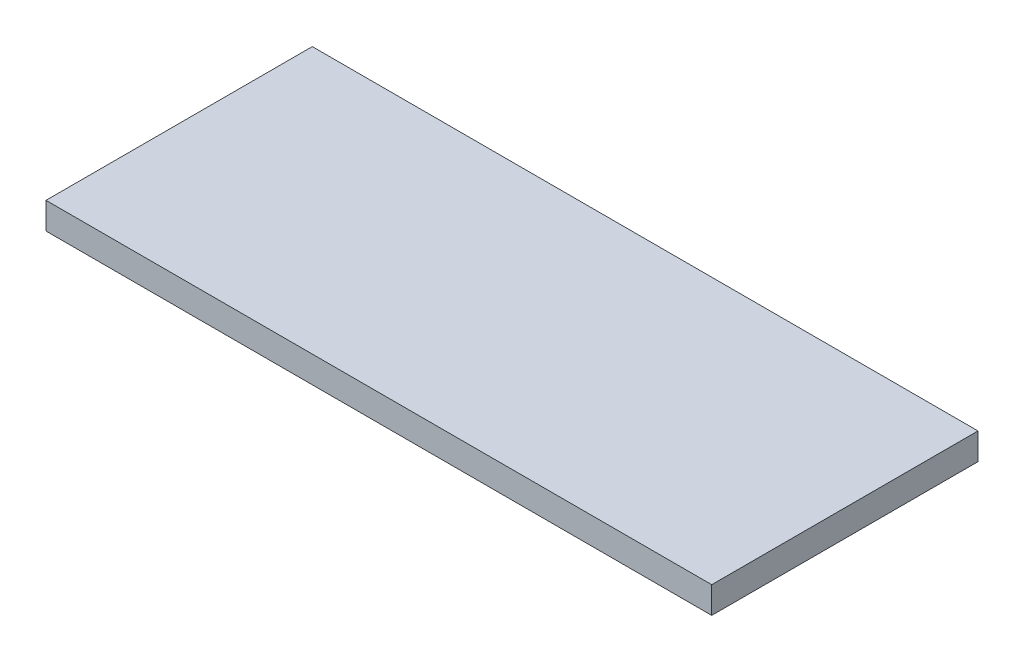
ISO-10303-21;
HEADER;
FILE_DESCRIPTION(('STEP AP214'),'2;1');
FILE_NAME('part.step','',(''),(''),'','','');
FILE_SCHEMA(('AUTOMOTIVE_DESIGN { 1 0 10303 214 1 1 1 1 }'));
ENDSEC;
DATA;
#1=APPLICATION_CONTEXT('core data for automotive mechanical design processes');
#2=APPLICATION_PROTOCOL_DEFINITION('international standard','automotive_design',2000,#1);
#3=PRODUCT_CONTEXT('',#1,'mechanical');
#4=PRODUCT('Part','Part','',(#3));
#5=PRODUCT_RELATED_PRODUCT_CATEGORY('part','',(#4));
#6=PRODUCT_DEFINITION_FORMATION('','',#4);
#7=PRODUCT_DEFINITION_CONTEXT('part definition',#1,'design');
#8=PRODUCT_DEFINITION('design','',#6,#7);
#9=PRODUCT_DEFINITION_SHAPE('','',#8);
#10=(LENGTH_UNIT() NAMED_UNIT(*) SI_UNIT(.MILLI.,.METRE.));
#11=(NAMED_UNIT(*) PLANE_ANGLE_UNIT() SI_UNIT($,.RADIAN.));
#12=(NAMED_UNIT(*) SI_UNIT($,.STERADIAN.) SOLID_ANGLE_UNIT());
#13=UNCERTAINTY_MEASURE_WITH_UNIT(LENGTH_MEASURE(1.E-05),#10,'distance_accuracy_value','');
#14=(GEOMETRIC_REPRESENTATION_CONTEXT(3) GLOBAL_UNCERTAINTY_ASSIGNED_CONTEXT((#13)) GLOBAL_UNIT_ASSIGNED_CONTEXT((#10,
#11,#12)) REPRESENTATION_CONTEXT('',''));
#15=CARTESIAN_POINT('',(0.,0.,0.));
#16=DIRECTION('',(0.,0.,1.));
#17=DIRECTION('',(1.,0.,0.));
#18=AXIS2_PLACEMENT_3D('',#15,#16,#17);
#19=CARTESIAN_POINT('',(100.,780.,-400.));
#20=DIRECTION('',(-1.,0.,0.));
#21=DIRECTION('',(0.,0.,1.));
#22=AXIS2_PLACEMENT_3D('',#19,#20,#21);
#23=PLANE('',#22);
#24=DIRECTION('',(0.,-1.,0.));
#25=VECTOR('',#24,1.);
#26=CARTESIAN_POINT('',(100.,780.,-200.));
#27=LINE('',#26,#25);
#28=CARTESIAN_POINT('',(100.,800.,-200.));
#29=VERTEX_POINT('',#28);
#30=CARTESIAN_POINT('',(100.,780.,-200.));
#31=VERTEX_POINT('',#30);
#32=EDGE_CURVE('E103',#29,#31,#27,.T.);
#33=ORIENTED_EDGE('',*,*,#32,.F.);
#34=DIRECTION('',(0.,0.,1.));
#35=VECTOR('',#34,1.);
#36=CARTESIAN_POINT('',(100.,800.,-400.));
#37=LINE('',#36,#35);
#38=CARTESIAN_POINT('',(100.,800.,-400.));
#39=VERTEX_POINT('',#38);
#40=EDGE_CURVE('E11',#39,#29,#37,.T.);
#41=ORIENTED_EDGE('',*,*,#40,.F.);
#42=DIRECTION('',(0.,-1.,0.));
#43=VECTOR('',#42,1.);
#44=CARTESIAN_POINT('',(100.,780.,-400.));
#45=LINE('',#44,#43);
#46=CARTESIAN_POINT('',(100.,780.,-400.));
#47=VERTEX_POINT('',#46);
#48=EDGE_CURVE('E97',#39,#47,#45,.T.);
#49=ORIENTED_EDGE('',*,*,#48,.T.);
#50=DIRECTION('',(0.,0.,1.));
#51=VECTOR('',#50,1.);
#52=CARTESIAN_POINT('',(100.,780.,-400.));
#53=LINE('',#52,#51);
#54=EDGE_CURVE('E42',#47,#31,#53,.T.);
#55=ORIENTED_EDGE('',*,*,#54,.T.);
#56=EDGE_LOOP('',(#33,#41,#49,#55));
#57=FACE_BOUND('',#56,.T.);
#58=ADVANCED_FACE('F39',(#57),#23,.T.);
#59=CARTESIAN_POINT('',(100.,800.,-400.));
#60=DIRECTION('',(0.,1.,0.));
#61=DIRECTION('',(0.,0.,1.));
#62=AXIS2_PLACEMENT_3D('',#59,#60,#61);
#63=PLANE('',#62);
#64=DIRECTION('',(-1.,0.,0.));
#65=VECTOR('',#64,1.);
#66=CARTESIAN_POINT('',(100.,800.,-200.));
#67=LINE('',#66,#65);
#68=CARTESIAN_POINT('',(600.,800.,-200.));
#69=VERTEX_POINT('',#68);
#70=EDGE_CURVE('E99',#69,#29,#67,.T.);
#71=ORIENTED_EDGE('',*,*,#70,.F.);
#72=DIRECTION('',(0.,0.,1.));
#73=VECTOR('',#72,1.);
#74=CARTESIAN_POINT('',(600.,800.,-400.));
#75=LINE('',#74,#73);
#76=CARTESIAN_POINT('',(600.,800.,-400.));
#77=VERTEX_POINT('',#76);
#78=EDGE_CURVE('E48',#77,#69,#75,.T.);
#79=ORIENTED_EDGE('',*,*,#78,.F.);
#80=DIRECTION('',(-1.,0.,0.));
#81=VECTOR('',#80,1.);
#82=CARTESIAN_POINT('',(100.,800.,-400.));
#83=LINE('',#82,#81);
#84=EDGE_CURVE('E94',#77,#39,#83,.T.);
#85=ORIENTED_EDGE('',*,*,#84,.T.);
#86=ORIENTED_EDGE('',*,*,#40,.T.);
#87=EDGE_LOOP('',(#71,#79,#85,#86));
#88=FACE_BOUND('',#87,.T.);
#89=ADVANCED_FACE('F113',(#88),#63,.T.);
#90=CARTESIAN_POINT('',(600.,780.,-400.));
#91=DIRECTION('',(1.,0.,0.));
#92=DIRECTION('',(0.,0.,-1.));
#93=AXIS2_PLACEMENT_3D('',#90,#91,#92);
#94=PLANE('',#93);
#95=DIRECTION('',(0.,1.,0.));
#96=VECTOR('',#95,1.);
#97=CARTESIAN_POINT('',(600.,780.,-200.));
#98=LINE('',#97,#96);
#99=CARTESIAN_POINT('',(600.,780.,-200.));
#100=VERTEX_POINT('',#99);
#101=EDGE_CURVE('E89',#100,#69,#98,.T.);
#102=ORIENTED_EDGE('',*,*,#101,.F.);
#103=DIRECTION('',(0.,0.,1.));
#104=VECTOR('',#103,1.);
#105=CARTESIAN_POINT('',(600.,780.,-400.));
#106=LINE('',#105,#104);
#107=CARTESIAN_POINT('',(600.,780.,-400.));
#108=VERTEX_POINT('',#107);
#109=EDGE_CURVE('E84',#108,#100,#106,.T.);
#110=ORIENTED_EDGE('',*,*,#109,.F.);
#111=DIRECTION('',(0.,1.,0.));
#112=VECTOR('',#111,1.);
#113=CARTESIAN_POINT('',(600.,780.,-400.));
#114=LINE('',#113,#112);
#115=EDGE_CURVE('E87',#108,#77,#114,.T.);
#116=ORIENTED_EDGE('',*,*,#115,.T.);
#117=ORIENTED_EDGE('',*,*,#78,.T.);
#118=EDGE_LOOP('',(#102,#110,#116,#117));
#119=FACE_BOUND('',#118,.T.);
#120=ADVANCED_FACE('F86',(#119),#94,.T.);
#121=CARTESIAN_POINT('',(100.,780.,-400.));
#122=DIRECTION('',(0.,-1.,0.));
#123=DIRECTION('',(0.,0.,-1.));
#124=AXIS2_PLACEMENT_3D('',#121,#122,#123);
#125=PLANE('',#124);
#126=DIRECTION('',(1.,0.,0.));
#127=VECTOR('',#126,1.);
#128=CARTESIAN_POINT('',(100.,780.,-200.));
#129=LINE('',#128,#127);
#130=EDGE_CURVE('E106',#31,#100,#129,.T.);
#131=ORIENTED_EDGE('',*,*,#130,.F.);
#132=ORIENTED_EDGE('',*,*,#54,.F.);
#133=DIRECTION('',(1.,0.,0.));
#134=VECTOR('',#133,1.);
#135=CARTESIAN_POINT('',(100.,780.,-400.));
#136=LINE('',#135,#134);
#137=EDGE_CURVE('E93',#47,#108,#136,.T.);
#138=ORIENTED_EDGE('',*,*,#137,.T.);
#139=ORIENTED_EDGE('',*,*,#109,.T.);
#140=EDGE_LOOP('',(#131,#132,#138,#139));
#141=FACE_BOUND('',#140,.T.);
#142=ADVANCED_FACE('F96',(#141),#125,.T.);
#143=CARTESIAN_POINT('',(0.,0.,-400.));
#144=DIRECTION('',(0.,0.,-1.));
#145=DIRECTION('',(-1.,0.,0.));
#146=AXIS2_PLACEMENT_3D('',#143,#144,#145);
#147=PLANE('',#146);
#148=ORIENTED_EDGE('',*,*,#48,.F.);
#149=ORIENTED_EDGE('',*,*,#84,.F.);
#150=ORIENTED_EDGE('',*,*,#115,.F.);
#151=ORIENTED_EDGE('',*,*,#137,.F.);
#152=EDGE_LOOP('',(#148,#149,#150,#151));
#153=FACE_BOUND('',#152,.T.);
#154=ADVANCED_FACE('F92',(#153),#147,.T.);
#155=CARTESIAN_POINT('',(0.,0.,-200.));
#156=DIRECTION('',(0.,0.,-1.));
#157=DIRECTION('',(-1.,0.,0.));
#158=AXIS2_PLACEMENT_3D('',#155,#156,#157);
#159=PLANE('',#158);
#160=ORIENTED_EDGE('',*,*,#32,.T.);
#161=ORIENTED_EDGE('',*,*,#130,.T.);
#162=ORIENTED_EDGE('',*,*,#101,.T.);
#163=ORIENTED_EDGE('',*,*,#70,.T.);
#164=EDGE_LOOP('',(#160,#161,#162,#163));
#165=FACE_BOUND('',#164,.T.);
#166=ADVANCED_FACE('F112',(#165),#159,.F.);
#167=CLOSED_SHELL('',(#58,#89,#120,#142,#154,#166));
#168=MANIFOLD_SOLID_BREP('B2',#167);
#169=ADVANCED_BREP_SHAPE_REPRESENTATION('',(#18,#168),#14);
#170=SHAPE_DEFINITION_REPRESENTATION(#9,#169);
ENDSEC;
END-ISO-10303-21;
